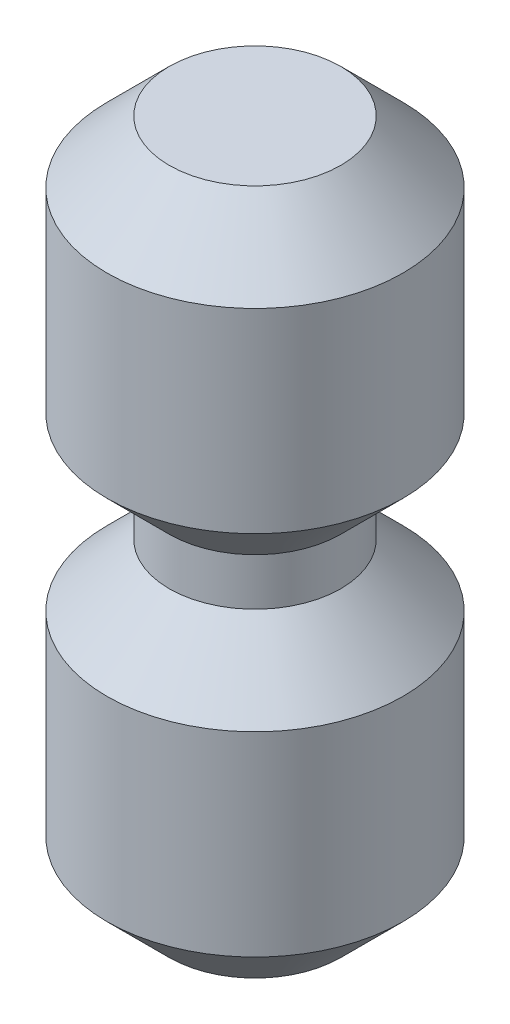
ISO-10303-21;
HEADER;
FILE_DESCRIPTION(('STEP AP214'),'2;1');
FILE_NAME('part.step','',(''),(''),'','','');
FILE_SCHEMA(('AUTOMOTIVE_DESIGN { 1 0 10303 214 1 1 1 1 }'));
ENDSEC;
DATA;
#1=APPLICATION_CONTEXT('core data for automotive mechanical design processes');
#2=APPLICATION_PROTOCOL_DEFINITION('international standard','automotive_design',2000,#1);
#3=PRODUCT_CONTEXT('',#1,'mechanical');
#4=PRODUCT('Part','Part','',(#3));
#5=PRODUCT_RELATED_PRODUCT_CATEGORY('part','',(#4));
#6=PRODUCT_DEFINITION_FORMATION('','',#4);
#7=PRODUCT_DEFINITION_CONTEXT('part definition',#1,'design');
#8=PRODUCT_DEFINITION('design','',#6,#7);
#9=PRODUCT_DEFINITION_SHAPE('','',#8);
#10=(LENGTH_UNIT() NAMED_UNIT(*) SI_UNIT(.MILLI.,.METRE.));
#11=(NAMED_UNIT(*) PLANE_ANGLE_UNIT() SI_UNIT($,.RADIAN.));
#12=(NAMED_UNIT(*) SI_UNIT($,.STERADIAN.) SOLID_ANGLE_UNIT());
#13=UNCERTAINTY_MEASURE_WITH_UNIT(LENGTH_MEASURE(1.E-05),#10,'distance_accuracy_value','');
#14=(GEOMETRIC_REPRESENTATION_CONTEXT(3) GLOBAL_UNCERTAINTY_ASSIGNED_CONTEXT((#13)) GLOBAL_UNIT_ASSIGNED_CONTEXT((#10,
#11,#12)) REPRESENTATION_CONTEXT('',''));
#15=CARTESIAN_POINT('',(0.,0.,0.));
#16=DIRECTION('',(0.,0.,1.));
#17=DIRECTION('',(1.,0.,0.));
#18=AXIS2_PLACEMENT_3D('',#15,#16,#17);
#19=CARTESIAN_POINT('',(1.,3.99999999999767,0.));
#20=DIRECTION('',(0.,1.,0.));
#21=DIRECTION('',(0.,0.,1.));
#22=AXIS2_PLACEMENT_3D('',#19,#20,#21);
#23=PLANE('',#22);
#24=CARTESIAN_POINT('',(0.,4.,0.));
#25=DIRECTION('',(0.,-1.,0.));
#26=DIRECTION('',(0.,0.,-1.));
#27=AXIS2_PLACEMENT_3D('',#24,#25,#26);
#28=CIRCLE('',#27,1.);
#29=CARTESIAN_POINT('',(0.,4.,-1.));
#30=VERTEX_POINT('',#29);
#31=EDGE_CURVE('E59',#30,#30,#28,.T.);
#32=ORIENTED_EDGE('',*,*,#31,.F.);
#33=EDGE_LOOP('',(#32));
#34=FACE_BOUND('',#33,.T.);
#35=ADVANCED_FACE('F31',(#34),#23,.T.);
#36=CARTESIAN_POINT('',(0.,-3.99999999999767,0.));
#37=DIRECTION('',(0.,-1.,0.));
#38=DIRECTION('',(0.,0.,-1.));
#39=AXIS2_PLACEMENT_3D('',#36,#37,#38);
#40=PLANE('',#39);
#41=CARTESIAN_POINT('',(0.,-4.,0.));
#42=DIRECTION('',(0.,-1.,0.));
#43=DIRECTION('',(0.,0.,-1.));
#44=AXIS2_PLACEMENT_3D('',#41,#42,#43);
#45=CIRCLE('',#44,1.);
#46=CARTESIAN_POINT('',(0.,-4.,-1.));
#47=VERTEX_POINT('',#46);
#48=EDGE_CURVE('E10',#47,#47,#45,.T.);
#49=ORIENTED_EDGE('',*,*,#48,.T.);
#50=EDGE_LOOP('',(#49));
#51=FACE_BOUND('',#50,.T.);
#52=ADVANCED_FACE('F67',(#51),#40,.T.);
#53=CARTESIAN_POINT('',(0.,-4.,0.));
#54=DIRECTION('',(0.,1.,0.));
#55=DIRECTION('',(0.,0.,1.));
#56=AXIS2_PLACEMENT_3D('',#53,#54,#55);
#57=CONICAL_SURFACE('',#56,1.,0.785398163397443);
#58=CARTESIAN_POINT('',(0.,-3.27499999999999,0.));
#59=DIRECTION('',(0.,-1.,0.));
#60=DIRECTION('',(0.,0.,-1.));
#61=AXIS2_PLACEMENT_3D('',#58,#59,#60);
#62=CIRCLE('',#61,1.725);
#63=CARTESIAN_POINT('',(0.,-3.27499999999999,-1.725));
#64=VERTEX_POINT('',#63);
#65=EDGE_CURVE('E37',#64,#64,#62,.T.);
#66=ORIENTED_EDGE('',*,*,#65,.T.);
#67=EDGE_LOOP('',(#66));
#68=FACE_BOUND('',#67,.T.);
#69=ORIENTED_EDGE('',*,*,#48,.F.);
#70=EDGE_LOOP('',(#69));
#71=FACE_BOUND('',#70,.T.);
#72=ADVANCED_FACE('F71',(#68,#71),#57,.T.);
#73=CARTESIAN_POINT('',(0.,0.,0.));
#74=DIRECTION('',(0.,-1.,0.));
#75=DIRECTION('',(0.,0.,-1.));
#76=AXIS2_PLACEMENT_3D('',#73,#74,#75);
#77=CYLINDRICAL_SURFACE('',#76,1.725);
#78=CARTESIAN_POINT('',(0.,-1.,0.));
#79=DIRECTION('',(0.,-1.,0.));
#80=DIRECTION('',(0.,0.,-1.));
#81=AXIS2_PLACEMENT_3D('',#78,#79,#80);
#82=CIRCLE('',#81,1.725);
#83=CARTESIAN_POINT('',(0.,-1.,-1.725));
#84=VERTEX_POINT('',#83);
#85=EDGE_CURVE('E41',#84,#84,#82,.T.);
#86=ORIENTED_EDGE('',*,*,#85,.T.);
#87=EDGE_LOOP('',(#86));
#88=FACE_BOUND('',#87,.T.);
#89=ORIENTED_EDGE('',*,*,#65,.F.);
#90=EDGE_LOOP('',(#89));
#91=FACE_BOUND('',#90,.T.);
#92=ADVANCED_FACE('F75',(#88,#91),#77,.T.);
#93=CARTESIAN_POINT('',(0.,-1.,0.));
#94=DIRECTION('',(0.,-1.,0.));
#95=DIRECTION('',(0.,0.,-1.));
#96=AXIS2_PLACEMENT_3D('',#93,#94,#95);
#97=CONICAL_SURFACE('',#96,1.725,0.785398163397443);
#98=CARTESIAN_POINT('',(0.,-0.274999999999992,0.));
#99=DIRECTION('',(0.,-1.,0.));
#100=DIRECTION('',(0.,0.,-1.));
#101=AXIS2_PLACEMENT_3D('',#98,#99,#100);
#102=CIRCLE('',#101,1.);
#103=CARTESIAN_POINT('',(0.,-0.274999999999992,-1.));
#104=VERTEX_POINT('',#103);
#105=EDGE_CURVE('E45',#104,#104,#102,.T.);
#106=ORIENTED_EDGE('',*,*,#105,.T.);
#107=EDGE_LOOP('',(#106));
#108=FACE_BOUND('',#107,.T.);
#109=ORIENTED_EDGE('',*,*,#85,.F.);
#110=EDGE_LOOP('',(#109));
#111=FACE_BOUND('',#110,.T.);
#112=ADVANCED_FACE('F80',(#108,#111),#97,.T.);
#113=CARTESIAN_POINT('',(0.,0.,0.));
#114=DIRECTION('',(0.,-1.,0.));
#115=DIRECTION('',(0.,0.,-1.));
#116=AXIS2_PLACEMENT_3D('',#113,#114,#115);
#117=CYLINDRICAL_SURFACE('',#116,1.);
#118=CARTESIAN_POINT('',(0.,0.274999999999992,0.));
#119=DIRECTION('',(0.,-1.,0.));
#120=DIRECTION('',(0.,0.,-1.));
#121=AXIS2_PLACEMENT_3D('',#118,#119,#120);
#122=CIRCLE('',#121,1.);
#123=CARTESIAN_POINT('',(0.,0.274999999999992,-1.));
#124=VERTEX_POINT('',#123);
#125=EDGE_CURVE('E50',#124,#124,#122,.T.);
#126=ORIENTED_EDGE('',*,*,#125,.T.);
#127=EDGE_LOOP('',(#126));
#128=FACE_BOUND('',#127,.T.);
#129=ORIENTED_EDGE('',*,*,#105,.F.);
#130=EDGE_LOOP('',(#129));
#131=FACE_BOUND('',#130,.T.);
#132=ADVANCED_FACE('F84',(#128,#131),#117,.T.);
#133=CARTESIAN_POINT('',(0.,0.274999999999992,0.));
#134=DIRECTION('',(0.,1.,0.));
#135=DIRECTION('',(0.,0.,1.));
#136=AXIS2_PLACEMENT_3D('',#133,#134,#135);
#137=CONICAL_SURFACE('',#136,1.,0.785398163397443);
#138=CARTESIAN_POINT('',(0.,1.,0.));
#139=DIRECTION('',(0.,-1.,0.));
#140=DIRECTION('',(0.,0.,-1.));
#141=AXIS2_PLACEMENT_3D('',#138,#139,#140);
#142=CIRCLE('',#141,1.725);
#143=CARTESIAN_POINT('',(0.,1.,-1.725));
#144=VERTEX_POINT('',#143);
#145=EDGE_CURVE('E53',#144,#144,#142,.T.);
#146=ORIENTED_EDGE('',*,*,#145,.T.);
#147=EDGE_LOOP('',(#146));
#148=FACE_BOUND('',#147,.T.);
#149=ORIENTED_EDGE('',*,*,#125,.F.);
#150=EDGE_LOOP('',(#149));
#151=FACE_BOUND('',#150,.T.);
#152=ADVANCED_FACE('F88',(#148,#151),#137,.T.);
#153=CARTESIAN_POINT('',(0.,0.,0.));
#154=DIRECTION('',(0.,-1.,0.));
#155=DIRECTION('',(0.,0.,-1.));
#156=AXIS2_PLACEMENT_3D('',#153,#154,#155);
#157=CYLINDRICAL_SURFACE('',#156,1.725);
#158=CARTESIAN_POINT('',(0.,3.27499999999999,0.));
#159=DIRECTION('',(0.,-1.,0.));
#160=DIRECTION('',(0.,0.,-1.));
#161=AXIS2_PLACEMENT_3D('',#158,#159,#160);
#162=CIRCLE('',#161,1.725);
#163=CARTESIAN_POINT('',(0.,3.27499999999999,-1.725));
#164=VERTEX_POINT('',#163);
#165=EDGE_CURVE('E56',#164,#164,#162,.T.);
#166=ORIENTED_EDGE('',*,*,#165,.T.);
#167=EDGE_LOOP('',(#166));
#168=FACE_BOUND('',#167,.T.);
#169=ORIENTED_EDGE('',*,*,#145,.F.);
#170=EDGE_LOOP('',(#169));
#171=FACE_BOUND('',#170,.T.);
#172=ADVANCED_FACE('F92',(#168,#171),#157,.T.);
#173=CARTESIAN_POINT('',(0.,3.27499999999999,0.));
#174=DIRECTION('',(0.,-1.,0.));
#175=DIRECTION('',(0.,0.,-1.));
#176=AXIS2_PLACEMENT_3D('',#173,#174,#175);
#177=CONICAL_SURFACE('',#176,1.725,0.785398163397443);
#178=ORIENTED_EDGE('',*,*,#31,.T.);
#179=EDGE_LOOP('',(#178));
#180=FACE_BOUND('',#179,.T.);
#181=ORIENTED_EDGE('',*,*,#165,.F.);
#182=EDGE_LOOP('',(#181));
#183=FACE_BOUND('',#182,.T.);
#184=ADVANCED_FACE('F63',(#180,#183),#177,.T.);
#185=CLOSED_SHELL('',(#35,#52,#72,#92,#112,#132,#152,#172,#184));
#186=MANIFOLD_SOLID_BREP('B2',#185);
#187=ADVANCED_BREP_SHAPE_REPRESENTATION('',(#18,#186),#14);
#188=SHAPE_DEFINITION_REPRESENTATION(#9,#187);
ENDSEC;
END-ISO-10303-21;
